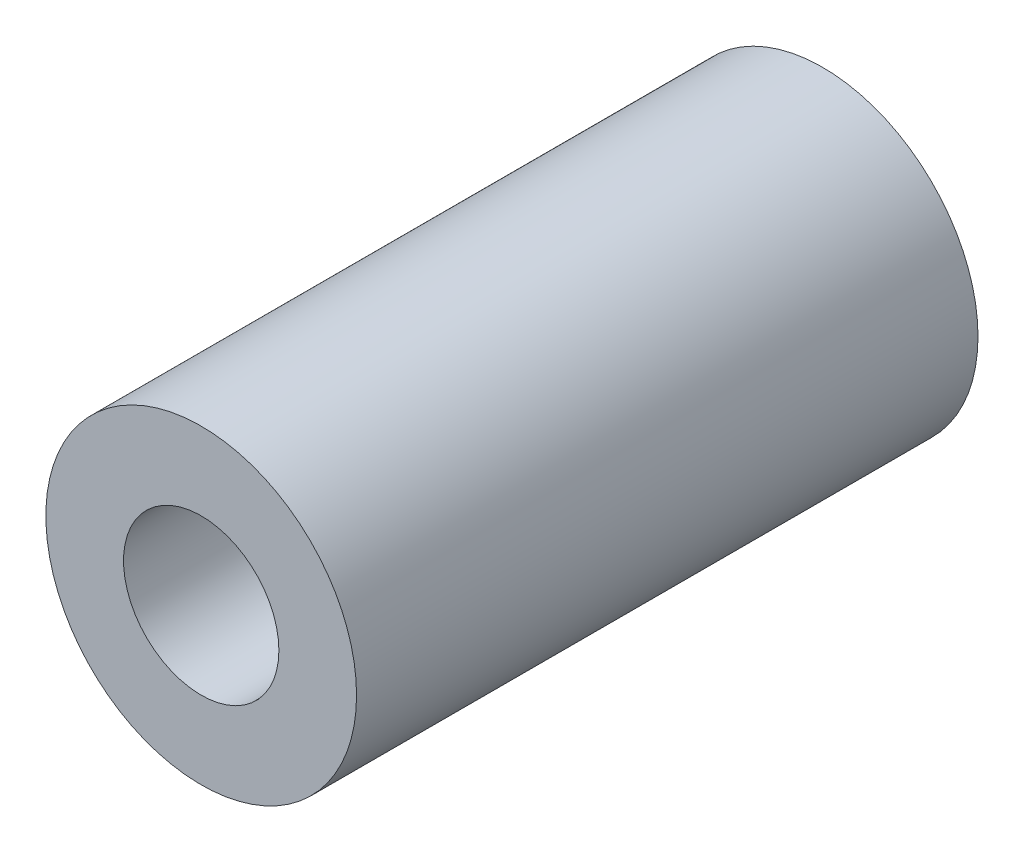
ISO-10303-21;
HEADER;
FILE_DESCRIPTION(('STEP AP214'),'2;1');
FILE_NAME('part.step','',(''),(''),'','','');
FILE_SCHEMA(('AUTOMOTIVE_DESIGN { 1 0 10303 214 1 1 1 1 }'));
ENDSEC;
DATA;
#1=APPLICATION_CONTEXT('core data for automotive mechanical design processes');
#2=APPLICATION_PROTOCOL_DEFINITION('international standard','automotive_design',2000,#1);
#3=PRODUCT_CONTEXT('',#1,'mechanical');
#4=PRODUCT('Part','Part','',(#3));
#5=PRODUCT_RELATED_PRODUCT_CATEGORY('part','',(#4));
#6=PRODUCT_DEFINITION_FORMATION('','',#4);
#7=PRODUCT_DEFINITION_CONTEXT('part definition',#1,'design');
#8=PRODUCT_DEFINITION('design','',#6,#7);
#9=PRODUCT_DEFINITION_SHAPE('','',#8);
#10=(LENGTH_UNIT() NAMED_UNIT(*) SI_UNIT(.MILLI.,.METRE.));
#11=(NAMED_UNIT(*) PLANE_ANGLE_UNIT() SI_UNIT($,.RADIAN.));
#12=(NAMED_UNIT(*) SI_UNIT($,.STERADIAN.) SOLID_ANGLE_UNIT());
#13=UNCERTAINTY_MEASURE_WITH_UNIT(LENGTH_MEASURE(1.E-05),#10,'distance_accuracy_value','');
#14=(GEOMETRIC_REPRESENTATION_CONTEXT(3) GLOBAL_UNCERTAINTY_ASSIGNED_CONTEXT((#13)) GLOBAL_UNIT_ASSIGNED_CONTEXT((#10,
#11,#12)) REPRESENTATION_CONTEXT('',''));
#15=CARTESIAN_POINT('',(0.,0.,0.));
#16=DIRECTION('',(0.,0.,1.));
#17=DIRECTION('',(1.,0.,0.));
#18=AXIS2_PLACEMENT_3D('',#15,#16,#17);
#19=CARTESIAN_POINT('',(0.,0.,20.));
#20=DIRECTION('',(0.,0.,1.));
#21=DIRECTION('',(1.,0.,0.));
#22=AXIS2_PLACEMENT_3D('',#19,#20,#21);
#23=PLANE('',#22);
#24=CARTESIAN_POINT('',(0.,0.,20.));
#25=DIRECTION('',(0.,0.,1.));
#26=DIRECTION('',(1.,0.,0.));
#27=AXIS2_PLACEMENT_3D('',#24,#25,#26);
#28=CIRCLE('',#27,10.);
#29=CARTESIAN_POINT('',(10.,0.,20.));
#30=VERTEX_POINT('',#29);
#31=EDGE_CURVE('E10',#30,#30,#28,.T.);
#32=ORIENTED_EDGE('',*,*,#31,.T.);
#33=EDGE_LOOP('',(#32));
#34=FACE_BOUND('',#33,.T.);
#35=CARTESIAN_POINT('',(0.,0.,20.));
#36=DIRECTION('',(0.,0.,1.));
#37=DIRECTION('',(1.,0.,0.));
#38=AXIS2_PLACEMENT_3D('',#35,#36,#37);
#39=CIRCLE('',#38,5.);
#40=CARTESIAN_POINT('',(5.,0.,20.));
#41=VERTEX_POINT('',#40);
#42=EDGE_CURVE('E48',#41,#41,#39,.T.);
#43=ORIENTED_EDGE('',*,*,#42,.F.);
#44=EDGE_LOOP('',(#43));
#45=FACE_BOUND('',#44,.T.);
#46=ADVANCED_FACE('F37',(#34,#45),#23,.T.);
#47=CARTESIAN_POINT('',(0.,0.,-20.));
#48=DIRECTION('',(0.,0.,1.));
#49=DIRECTION('',(1.,0.,0.));
#50=AXIS2_PLACEMENT_3D('',#47,#48,#49);
#51=PLANE('',#50);
#52=CARTESIAN_POINT('',(0.,0.,-20.));
#53=DIRECTION('',(0.,0.,1.));
#54=DIRECTION('',(1.,0.,0.));
#55=AXIS2_PLACEMENT_3D('',#52,#53,#54);
#56=CIRCLE('',#55,10.);
#57=CARTESIAN_POINT('',(10.,0.,-20.));
#58=VERTEX_POINT('',#57);
#59=EDGE_CURVE('E41',#58,#58,#56,.T.);
#60=ORIENTED_EDGE('',*,*,#59,.F.);
#61=EDGE_LOOP('',(#60));
#62=FACE_BOUND('',#61,.T.);
#63=CARTESIAN_POINT('',(0.,0.,-20.));
#64=DIRECTION('',(0.,0.,1.));
#65=DIRECTION('',(1.,0.,0.));
#66=AXIS2_PLACEMENT_3D('',#63,#64,#65);
#67=CIRCLE('',#66,5.);
#68=CARTESIAN_POINT('',(5.,0.,-20.));
#69=VERTEX_POINT('',#68);
#70=EDGE_CURVE('E50',#69,#69,#67,.T.);
#71=ORIENTED_EDGE('',*,*,#70,.T.);
#72=EDGE_LOOP('',(#71));
#73=FACE_BOUND('',#72,.T.);
#74=ADVANCED_FACE('F60',(#62,#73),#51,.F.);
#75=CARTESIAN_POINT('',(0.,0.,20.));
#76=DIRECTION('',(0.,0.,-1.));
#77=DIRECTION('',(-1.,0.,0.));
#78=AXIS2_PLACEMENT_3D('',#75,#76,#77);
#79=CYLINDRICAL_SURFACE('',#78,10.);
#80=ORIENTED_EDGE('',*,*,#31,.F.);
#81=EDGE_LOOP('',(#80));
#82=FACE_BOUND('',#81,.T.);
#83=ORIENTED_EDGE('',*,*,#59,.T.);
#84=EDGE_LOOP('',(#83));
#85=FACE_BOUND('',#84,.T.);
#86=ADVANCED_FACE('F39',(#82,#85),#79,.T.);
#87=CARTESIAN_POINT('',(0.,0.,20.));
#88=DIRECTION('',(0.,0.,-1.));
#89=DIRECTION('',(-1.,0.,0.));
#90=AXIS2_PLACEMENT_3D('',#87,#88,#89);
#91=CYLINDRICAL_SURFACE('',#90,5.);
#92=ORIENTED_EDGE('',*,*,#42,.T.);
#93=EDGE_LOOP('',(#92));
#94=FACE_BOUND('',#93,.T.);
#95=ORIENTED_EDGE('',*,*,#70,.F.);
#96=EDGE_LOOP('',(#95));
#97=FACE_BOUND('',#96,.T.);
#98=ADVANCED_FACE('F56',(#94,#97),#91,.F.);
#99=CLOSED_SHELL('',(#46,#74,#86,#98));
#100=MANIFOLD_SOLID_BREP('B2',#99);
#101=ADVANCED_BREP_SHAPE_REPRESENTATION('',(#18,#100),#14);
#102=SHAPE_DEFINITION_REPRESENTATION(#9,#101);
ENDSEC;
END-ISO-10303-21;
